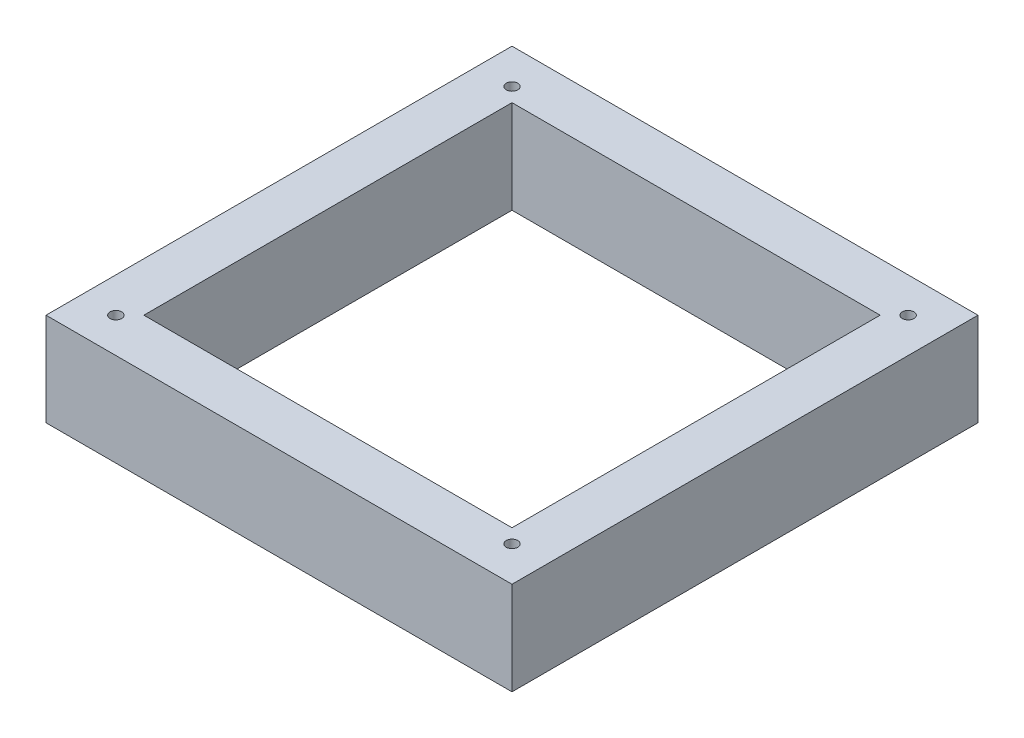
ISO-10303-21;
HEADER;
FILE_DESCRIPTION(('STEP AP214'),'2;1');
FILE_NAME('part.step','',(''),(''),'','','');
FILE_SCHEMA(('AUTOMOTIVE_DESIGN { 1 0 10303 214 1 1 1 1 }'));
ENDSEC;
DATA;
#1=APPLICATION_CONTEXT('core data for automotive mechanical design processes');
#2=APPLICATION_PROTOCOL_DEFINITION('international standard','automotive_design',2000,#1);
#3=PRODUCT_CONTEXT('',#1,'mechanical');
#4=PRODUCT('Part','Part','',(#3));
#5=PRODUCT_RELATED_PRODUCT_CATEGORY('part','',(#4));
#6=PRODUCT_DEFINITION_FORMATION('','',#4);
#7=PRODUCT_DEFINITION_CONTEXT('part definition',#1,'design');
#8=PRODUCT_DEFINITION('design','',#6,#7);
#9=PRODUCT_DEFINITION_SHAPE('','',#8);
#10=(LENGTH_UNIT() NAMED_UNIT(*) SI_UNIT(.MILLI.,.METRE.));
#11=(NAMED_UNIT(*) PLANE_ANGLE_UNIT() SI_UNIT($,.RADIAN.));
#12=(NAMED_UNIT(*) SI_UNIT($,.STERADIAN.) SOLID_ANGLE_UNIT());
#13=UNCERTAINTY_MEASURE_WITH_UNIT(LENGTH_MEASURE(1.E-05),#10,'distance_accuracy_value','');
#14=(GEOMETRIC_REPRESENTATION_CONTEXT(3) GLOBAL_UNCERTAINTY_ASSIGNED_CONTEXT((#13)) GLOBAL_UNIT_ASSIGNED_CONTEXT((#10,
#11,#12)) REPRESENTATION_CONTEXT('',''));
#15=CARTESIAN_POINT('',(0.,0.,0.));
#16=DIRECTION('',(0.,0.,1.));
#17=DIRECTION('',(1.,0.,0.));
#18=AXIS2_PLACEMENT_3D('',#15,#16,#17);
#19=CARTESIAN_POINT('',(0.,40.,0.));
#20=DIRECTION('',(0.,-1.,0.));
#21=DIRECTION('',(0.,0.,-1.));
#22=AXIS2_PLACEMENT_3D('',#19,#20,#21);
#23=PLANE('',#22);
#24=DIRECTION('',(0.,0.,1.));
#25=VECTOR('',#24,1.);
#26=CARTESIAN_POINT('',(0.,40.,0.));
#27=LINE('',#26,#25);
#28=CARTESIAN_POINT('',(0.,40.,-200.));
#29=VERTEX_POINT('',#28);
#30=CARTESIAN_POINT('',(0.,40.,0.));
#31=VERTEX_POINT('',#30);
#32=EDGE_CURVE('E137',#29,#31,#27,.T.);
#33=ORIENTED_EDGE('',*,*,#32,.T.);
#34=DIRECTION('',(1.,0.,0.));
#35=VECTOR('',#34,1.);
#36=CARTESIAN_POINT('',(0.,40.,0.));
#37=LINE('',#36,#35);
#38=CARTESIAN_POINT('',(200.,40.,0.));
#39=VERTEX_POINT('',#38);
#40=EDGE_CURVE('E140',#31,#39,#37,.T.);
#41=ORIENTED_EDGE('',*,*,#40,.T.);
#42=DIRECTION('',(0.,0.,-1.));
#43=VECTOR('',#42,1.);
#44=CARTESIAN_POINT('',(200.,40.,0.));
#45=LINE('',#44,#43);
#46=CARTESIAN_POINT('',(200.,40.,-200.));
#47=VERTEX_POINT('',#46);
#48=EDGE_CURVE('E143',#39,#47,#45,.T.);
#49=ORIENTED_EDGE('',*,*,#48,.T.);
#50=DIRECTION('',(-1.,0.,0.));
#51=VECTOR('',#50,1.);
#52=CARTESIAN_POINT('',(0.,40.,-200.));
#53=LINE('',#52,#51);
#54=EDGE_CURVE('E145',#47,#29,#53,.T.);
#55=ORIENTED_EDGE('',*,*,#54,.T.);
#56=EDGE_LOOP('',(#33,#41,#49,#55));
#57=FACE_BOUND('',#56,.T.);
#58=DIRECTION('',(0.,0.,-1.));
#59=VECTOR('',#58,1.);
#60=CARTESIAN_POINT('',(179.,40.,-20.9999999999999));
#61=LINE('',#60,#59);
#62=CARTESIAN_POINT('',(179.,40.,-20.9999999999999));
#63=VERTEX_POINT('',#62);
#64=CARTESIAN_POINT('',(179.,40.,-179.));
#65=VERTEX_POINT('',#64);
#66=EDGE_CURVE('E98',#63,#65,#61,.T.);
#67=ORIENTED_EDGE('',*,*,#66,.F.);
#68=DIRECTION('',(1.,0.,0.));
#69=VECTOR('',#68,1.);
#70=CARTESIAN_POINT('',(21.,40.,-20.9999999999999));
#71=LINE('',#70,#69);
#72=CARTESIAN_POINT('',(21.,40.,-20.9999999999999));
#73=VERTEX_POINT('',#72);
#74=EDGE_CURVE('E121',#73,#63,#71,.T.);
#75=ORIENTED_EDGE('',*,*,#74,.F.);
#76=DIRECTION('',(0.,0.,1.));
#77=VECTOR('',#76,1.);
#78=CARTESIAN_POINT('',(21.,40.,-20.9999999999999));
#79=LINE('',#78,#77);
#80=CARTESIAN_POINT('',(21.,40.,-179.));
#81=VERTEX_POINT('',#80);
#82=EDGE_CURVE('E119',#81,#73,#79,.T.);
#83=ORIENTED_EDGE('',*,*,#82,.F.);
#84=DIRECTION('',(-1.,0.,0.));
#85=VECTOR('',#84,1.);
#86=CARTESIAN_POINT('',(21.,40.,-179.));
#87=LINE('',#86,#85);
#88=EDGE_CURVE('E106',#65,#81,#87,.T.);
#89=ORIENTED_EDGE('',*,*,#88,.F.);
#90=EDGE_LOOP('',(#67,#75,#83,#89));
#91=FACE_BOUND('',#90,.T.);
#92=CARTESIAN_POINT('',(185.,40.,-185.));
#93=DIRECTION('',(0.,1.,0.));
#94=DIRECTION('',(0.,0.,1.));
#95=AXIS2_PLACEMENT_3D('',#92,#93,#94);
#96=CIRCLE('',#95,2.5);
#97=CARTESIAN_POINT('',(185.,40.,-182.5));
#98=VERTEX_POINT('',#97);
#99=EDGE_CURVE('E127',#98,#98,#96,.T.);
#100=ORIENTED_EDGE('',*,*,#99,.F.);
#101=EDGE_LOOP('',(#100));
#102=FACE_BOUND('',#101,.T.);
#103=CARTESIAN_POINT('',(185.,40.,-15.));
#104=DIRECTION('',(0.,1.,0.));
#105=DIRECTION('',(0.,0.,1.));
#106=AXIS2_PLACEMENT_3D('',#103,#104,#105);
#107=CIRCLE('',#106,2.5);
#108=CARTESIAN_POINT('',(185.,40.,-12.5));
#109=VERTEX_POINT('',#108);
#110=EDGE_CURVE('E249',#109,#109,#107,.T.);
#111=ORIENTED_EDGE('',*,*,#110,.F.);
#112=EDGE_LOOP('',(#111));
#113=FACE_BOUND('',#112,.T.);
#114=CARTESIAN_POINT('',(15.,40.,-15.));
#115=DIRECTION('',(0.,1.,0.));
#116=DIRECTION('',(0.,0.,1.));
#117=AXIS2_PLACEMENT_3D('',#114,#115,#116);
#118=CIRCLE('',#117,2.5);
#119=CARTESIAN_POINT('',(15.,40.,-12.5));
#120=VERTEX_POINT('',#119);
#121=EDGE_CURVE('E243',#120,#120,#118,.T.);
#122=ORIENTED_EDGE('',*,*,#121,.F.);
#123=EDGE_LOOP('',(#122));
#124=FACE_BOUND('',#123,.T.);
#125=CARTESIAN_POINT('',(15.,40.,-185.));
#126=DIRECTION('',(0.,1.,0.));
#127=DIRECTION('',(0.,0.,1.));
#128=AXIS2_PLACEMENT_3D('',#125,#126,#127);
#129=CIRCLE('',#128,2.5);
#130=CARTESIAN_POINT('',(15.,40.,-182.5));
#131=VERTEX_POINT('',#130);
#132=EDGE_CURVE('E234',#131,#131,#129,.T.);
#133=ORIENTED_EDGE('',*,*,#132,.F.);
#134=EDGE_LOOP('',(#133));
#135=FACE_BOUND('',#134,.T.);
#136=ADVANCED_FACE('F33',(#57,#91,#102,#113,#124,#135),#23,.F.);
#137=CARTESIAN_POINT('',(0.,0.,0.));
#138=DIRECTION('',(0.,-1.,0.));
#139=DIRECTION('',(0.,0.,-1.));
#140=AXIS2_PLACEMENT_3D('',#137,#138,#139);
#141=PLANE('',#140);
#142=CARTESIAN_POINT('',(15.,0.,-15.));
#143=DIRECTION('',(0.,1.,0.));
#144=DIRECTION('',(0.,0.,1.));
#145=AXIS2_PLACEMENT_3D('',#142,#143,#144);
#146=CIRCLE('',#145,2.5);
#147=CARTESIAN_POINT('',(15.,0.,-12.5));
#148=VERTEX_POINT('',#147);
#149=EDGE_CURVE('E240',#148,#148,#146,.T.);
#150=ORIENTED_EDGE('',*,*,#149,.T.);
#151=EDGE_LOOP('',(#150));
#152=FACE_BOUND('',#151,.T.);
#153=CARTESIAN_POINT('',(185.,0.,-185.));
#154=DIRECTION('',(0.,1.,0.));
#155=DIRECTION('',(0.,0.,1.));
#156=AXIS2_PLACEMENT_3D('',#153,#154,#155);
#157=CIRCLE('',#156,2.5);
#158=CARTESIAN_POINT('',(185.,0.,-182.5));
#159=VERTEX_POINT('',#158);
#160=EDGE_CURVE('E252',#159,#159,#157,.T.);
#161=ORIENTED_EDGE('',*,*,#160,.T.);
#162=EDGE_LOOP('',(#161));
#163=FACE_BOUND('',#162,.T.);
#164=DIRECTION('',(0.,0.,1.));
#165=VECTOR('',#164,1.);
#166=CARTESIAN_POINT('',(0.,0.,0.));
#167=LINE('',#166,#165);
#168=CARTESIAN_POINT('',(0.,0.,-200.));
#169=VERTEX_POINT('',#168);
#170=CARTESIAN_POINT('',(0.,0.,0.));
#171=VERTEX_POINT('',#170);
#172=EDGE_CURVE('E114',#169,#171,#167,.T.);
#173=ORIENTED_EDGE('',*,*,#172,.F.);
#174=DIRECTION('',(-1.,0.,0.));
#175=VECTOR('',#174,1.);
#176=CARTESIAN_POINT('',(0.,0.,-200.));
#177=LINE('',#176,#175);
#178=CARTESIAN_POINT('',(200.,0.,-200.));
#179=VERTEX_POINT('',#178);
#180=EDGE_CURVE('E141',#179,#169,#177,.T.);
#181=ORIENTED_EDGE('',*,*,#180,.F.);
#182=DIRECTION('',(0.,0.,-1.));
#183=VECTOR('',#182,1.);
#184=CARTESIAN_POINT('',(200.,0.,0.));
#185=LINE('',#184,#183);
#186=CARTESIAN_POINT('',(200.,0.,0.));
#187=VERTEX_POINT('',#186);
#188=EDGE_CURVE('E152',#187,#179,#185,.T.);
#189=ORIENTED_EDGE('',*,*,#188,.F.);
#190=DIRECTION('',(1.,0.,0.));
#191=VECTOR('',#190,1.);
#192=CARTESIAN_POINT('',(0.,0.,0.));
#193=LINE('',#192,#191);
#194=EDGE_CURVE('E150',#171,#187,#193,.T.);
#195=ORIENTED_EDGE('',*,*,#194,.F.);
#196=EDGE_LOOP('',(#173,#181,#189,#195));
#197=FACE_BOUND('',#196,.T.);
#198=DIRECTION('',(1.,0.,0.));
#199=VECTOR('',#198,1.);
#200=CARTESIAN_POINT('',(21.,0.,-20.9999999999999));
#201=LINE('',#200,#199);
#202=CARTESIAN_POINT('',(21.,0.,-20.9999999999999));
#203=VERTEX_POINT('',#202);
#204=CARTESIAN_POINT('',(179.,0.,-20.9999999999999));
#205=VERTEX_POINT('',#204);
#206=EDGE_CURVE('E107',#203,#205,#201,.T.);
#207=ORIENTED_EDGE('',*,*,#206,.T.);
#208=DIRECTION('',(0.,0.,-1.));
#209=VECTOR('',#208,1.);
#210=CARTESIAN_POINT('',(179.,0.,-20.9999999999999));
#211=LINE('',#210,#209);
#212=CARTESIAN_POINT('',(179.,0.,-179.));
#213=VERTEX_POINT('',#212);
#214=EDGE_CURVE('E56',#205,#213,#211,.T.);
#215=ORIENTED_EDGE('',*,*,#214,.T.);
#216=DIRECTION('',(-1.,0.,0.));
#217=VECTOR('',#216,1.);
#218=CARTESIAN_POINT('',(21.,0.,-179.));
#219=LINE('',#218,#217);
#220=CARTESIAN_POINT('',(21.,0.,-179.));
#221=VERTEX_POINT('',#220);
#222=EDGE_CURVE('E113',#213,#221,#219,.T.);
#223=ORIENTED_EDGE('',*,*,#222,.T.);
#224=DIRECTION('',(0.,0.,1.));
#225=VECTOR('',#224,1.);
#226=CARTESIAN_POINT('',(21.,0.,-20.9999999999999));
#227=LINE('',#226,#225);
#228=EDGE_CURVE('E129',#221,#203,#227,.T.);
#229=ORIENTED_EDGE('',*,*,#228,.T.);
#230=EDGE_LOOP('',(#207,#215,#223,#229));
#231=FACE_BOUND('',#230,.T.);
#232=CARTESIAN_POINT('',(185.,0.,-15.));
#233=DIRECTION('',(0.,1.,0.));
#234=DIRECTION('',(0.,0.,1.));
#235=AXIS2_PLACEMENT_3D('',#232,#233,#234);
#236=CIRCLE('',#235,2.5);
#237=CARTESIAN_POINT('',(185.,0.,-12.5));
#238=VERTEX_POINT('',#237);
#239=EDGE_CURVE('E246',#238,#238,#236,.T.);
#240=ORIENTED_EDGE('',*,*,#239,.T.);
#241=EDGE_LOOP('',(#240));
#242=FACE_BOUND('',#241,.T.);
#243=CARTESIAN_POINT('',(15.,0.,-185.));
#244=DIRECTION('',(0.,1.,0.));
#245=DIRECTION('',(0.,0.,1.));
#246=AXIS2_PLACEMENT_3D('',#243,#244,#245);
#247=CIRCLE('',#246,2.5);
#248=CARTESIAN_POINT('',(15.,0.,-182.5));
#249=VERTEX_POINT('',#248);
#250=EDGE_CURVE('E237',#249,#249,#247,.T.);
#251=ORIENTED_EDGE('',*,*,#250,.T.);
#252=EDGE_LOOP('',(#251));
#253=FACE_BOUND('',#252,.T.);
#254=ADVANCED_FACE('F170',(#152,#163,#197,#231,#242,#253),#141,.T.);
#255=CARTESIAN_POINT('',(0.,40.,0.));
#256=DIRECTION('',(1.,0.,0.));
#257=DIRECTION('',(0.,0.,-1.));
#258=AXIS2_PLACEMENT_3D('',#255,#256,#257);
#259=PLANE('',#258);
#260=ORIENTED_EDGE('',*,*,#172,.T.);
#261=DIRECTION('',(0.,-1.,0.));
#262=VECTOR('',#261,1.);
#263=CARTESIAN_POINT('',(0.,40.,0.));
#264=LINE('',#263,#262);
#265=EDGE_CURVE('E11',#31,#171,#264,.T.);
#266=ORIENTED_EDGE('',*,*,#265,.F.);
#267=ORIENTED_EDGE('',*,*,#32,.F.);
#268=DIRECTION('',(0.,-1.,0.));
#269=VECTOR('',#268,1.);
#270=CARTESIAN_POINT('',(0.,40.,-200.));
#271=LINE('',#270,#269);
#272=EDGE_CURVE('E147',#29,#169,#271,.T.);
#273=ORIENTED_EDGE('',*,*,#272,.T.);
#274=EDGE_LOOP('',(#260,#266,#267,#273));
#275=FACE_BOUND('',#274,.T.);
#276=ADVANCED_FACE('F35',(#275),#259,.F.);
#277=CARTESIAN_POINT('',(0.,40.,0.));
#278=DIRECTION('',(0.,0.,-1.));
#279=DIRECTION('',(-1.,0.,0.));
#280=AXIS2_PLACEMENT_3D('',#277,#278,#279);
#281=PLANE('',#280);
#282=ORIENTED_EDGE('',*,*,#194,.T.);
#283=DIRECTION('',(0.,-1.,0.));
#284=VECTOR('',#283,1.);
#285=CARTESIAN_POINT('',(200.,40.,0.));
#286=LINE('',#285,#284);
#287=EDGE_CURVE('E41',#39,#187,#286,.T.);
#288=ORIENTED_EDGE('',*,*,#287,.F.);
#289=ORIENTED_EDGE('',*,*,#40,.F.);
#290=ORIENTED_EDGE('',*,*,#265,.T.);
#291=EDGE_LOOP('',(#282,#288,#289,#290));
#292=FACE_BOUND('',#291,.T.);
#293=ADVANCED_FACE('F180',(#292),#281,.F.);
#294=CARTESIAN_POINT('',(200.,40.,0.));
#295=DIRECTION('',(-1.,0.,0.));
#296=DIRECTION('',(0.,0.,1.));
#297=AXIS2_PLACEMENT_3D('',#294,#295,#296);
#298=PLANE('',#297);
#299=ORIENTED_EDGE('',*,*,#188,.T.);
#300=DIRECTION('',(0.,-1.,0.));
#301=VECTOR('',#300,1.);
#302=CARTESIAN_POINT('',(200.,40.,-200.));
#303=LINE('',#302,#301);
#304=EDGE_CURVE('E157',#47,#179,#303,.T.);
#305=ORIENTED_EDGE('',*,*,#304,.F.);
#306=ORIENTED_EDGE('',*,*,#48,.F.);
#307=ORIENTED_EDGE('',*,*,#287,.T.);
#308=EDGE_LOOP('',(#299,#305,#306,#307));
#309=FACE_BOUND('',#308,.T.);
#310=ADVANCED_FACE('F164',(#309),#298,.F.);
#311=CARTESIAN_POINT('',(0.,40.,-200.));
#312=DIRECTION('',(0.,0.,1.));
#313=DIRECTION('',(1.,0.,0.));
#314=AXIS2_PLACEMENT_3D('',#311,#312,#313);
#315=PLANE('',#314);
#316=ORIENTED_EDGE('',*,*,#180,.T.);
#317=ORIENTED_EDGE('',*,*,#272,.F.);
#318=ORIENTED_EDGE('',*,*,#54,.F.);
#319=ORIENTED_EDGE('',*,*,#304,.T.);
#320=EDGE_LOOP('',(#316,#317,#318,#319));
#321=FACE_BOUND('',#320,.T.);
#322=ADVANCED_FACE('F174',(#321),#315,.F.);
#323=CARTESIAN_POINT('',(179.,40.,-20.9999999999999));
#324=DIRECTION('',(-1.,0.,0.));
#325=DIRECTION('',(0.,0.,1.));
#326=AXIS2_PLACEMENT_3D('',#323,#324,#325);
#327=PLANE('',#326);
#328=ORIENTED_EDGE('',*,*,#214,.F.);
#329=DIRECTION('',(0.,-1.,0.));
#330=VECTOR('',#329,1.);
#331=CARTESIAN_POINT('',(179.,40.,-20.9999999999999));
#332=LINE('',#331,#330);
#333=EDGE_CURVE('E102',#63,#205,#332,.T.);
#334=ORIENTED_EDGE('',*,*,#333,.F.);
#335=ORIENTED_EDGE('',*,*,#66,.T.);
#336=DIRECTION('',(0.,-1.,0.));
#337=VECTOR('',#336,1.);
#338=CARTESIAN_POINT('',(179.,40.,-179.));
#339=LINE('',#338,#337);
#340=EDGE_CURVE('E101',#65,#213,#339,.T.);
#341=ORIENTED_EDGE('',*,*,#340,.T.);
#342=EDGE_LOOP('',(#328,#334,#335,#341));
#343=FACE_BOUND('',#342,.T.);
#344=ADVANCED_FACE('F100',(#343),#327,.T.);
#345=CARTESIAN_POINT('',(21.,40.,-179.));
#346=DIRECTION('',(0.,0.,1.));
#347=DIRECTION('',(1.,0.,0.));
#348=AXIS2_PLACEMENT_3D('',#345,#346,#347);
#349=PLANE('',#348);
#350=ORIENTED_EDGE('',*,*,#222,.F.);
#351=ORIENTED_EDGE('',*,*,#340,.F.);
#352=ORIENTED_EDGE('',*,*,#88,.T.);
#353=DIRECTION('',(0.,-1.,0.));
#354=VECTOR('',#353,1.);
#355=CARTESIAN_POINT('',(21.,40.,-179.));
#356=LINE('',#355,#354);
#357=EDGE_CURVE('E115',#81,#221,#356,.T.);
#358=ORIENTED_EDGE('',*,*,#357,.T.);
#359=EDGE_LOOP('',(#350,#351,#352,#358));
#360=FACE_BOUND('',#359,.T.);
#361=ADVANCED_FACE('F110',(#360),#349,.T.);
#362=CARTESIAN_POINT('',(21.,40.,-20.9999999999999));
#363=DIRECTION('',(1.,0.,0.));
#364=DIRECTION('',(0.,0.,-1.));
#365=AXIS2_PLACEMENT_3D('',#362,#363,#364);
#366=PLANE('',#365);
#367=ORIENTED_EDGE('',*,*,#228,.F.);
#368=ORIENTED_EDGE('',*,*,#357,.F.);
#369=ORIENTED_EDGE('',*,*,#82,.T.);
#370=DIRECTION('',(0.,-1.,0.));
#371=VECTOR('',#370,1.);
#372=CARTESIAN_POINT('',(21.,40.,-20.9999999999999));
#373=LINE('',#372,#371);
#374=EDGE_CURVE('E48',#73,#203,#373,.T.);
#375=ORIENTED_EDGE('',*,*,#374,.T.);
#376=EDGE_LOOP('',(#367,#368,#369,#375));
#377=FACE_BOUND('',#376,.T.);
#378=ADVANCED_FACE('F204',(#377),#366,.T.);
#379=CARTESIAN_POINT('',(21.,40.,-20.9999999999999));
#380=DIRECTION('',(0.,0.,-1.));
#381=DIRECTION('',(-1.,0.,0.));
#382=AXIS2_PLACEMENT_3D('',#379,#380,#381);
#383=PLANE('',#382);
#384=ORIENTED_EDGE('',*,*,#206,.F.);
#385=ORIENTED_EDGE('',*,*,#374,.F.);
#386=ORIENTED_EDGE('',*,*,#74,.T.);
#387=ORIENTED_EDGE('',*,*,#333,.T.);
#388=EDGE_LOOP('',(#384,#385,#386,#387));
#389=FACE_BOUND('',#388,.T.);
#390=ADVANCED_FACE('F208',(#389),#383,.T.);
#391=CARTESIAN_POINT('',(185.,40.,-185.));
#392=DIRECTION('',(0.,-1.,0.));
#393=DIRECTION('',(0.,0.,-1.));
#394=AXIS2_PLACEMENT_3D('',#391,#392,#393);
#395=CYLINDRICAL_SURFACE('',#394,2.5);
#396=ORIENTED_EDGE('',*,*,#99,.T.);
#397=EDGE_LOOP('',(#396));
#398=FACE_BOUND('',#397,.T.);
#399=ORIENTED_EDGE('',*,*,#160,.F.);
#400=EDGE_LOOP('',(#399));
#401=FACE_BOUND('',#400,.T.);
#402=ADVANCED_FACE('F214',(#398,#401),#395,.F.);
#403=CARTESIAN_POINT('',(185.,40.,-15.));
#404=DIRECTION('',(0.,-1.,0.));
#405=DIRECTION('',(0.,0.,-1.));
#406=AXIS2_PLACEMENT_3D('',#403,#404,#405);
#407=CYLINDRICAL_SURFACE('',#406,2.5);
#408=ORIENTED_EDGE('',*,*,#110,.T.);
#409=EDGE_LOOP('',(#408));
#410=FACE_BOUND('',#409,.T.);
#411=ORIENTED_EDGE('',*,*,#239,.F.);
#412=EDGE_LOOP('',(#411));
#413=FACE_BOUND('',#412,.T.);
#414=ADVANCED_FACE('F217',(#410,#413),#407,.F.);
#415=CARTESIAN_POINT('',(15.,40.,-15.));
#416=DIRECTION('',(0.,-1.,0.));
#417=DIRECTION('',(0.,0.,-1.));
#418=AXIS2_PLACEMENT_3D('',#415,#416,#417);
#419=CYLINDRICAL_SURFACE('',#418,2.5);
#420=ORIENTED_EDGE('',*,*,#121,.T.);
#421=EDGE_LOOP('',(#420));
#422=FACE_BOUND('',#421,.T.);
#423=ORIENTED_EDGE('',*,*,#149,.F.);
#424=EDGE_LOOP('',(#423));
#425=FACE_BOUND('',#424,.T.);
#426=ADVANCED_FACE('F221',(#422,#425),#419,.F.);
#427=CARTESIAN_POINT('',(15.,40.,-185.));
#428=DIRECTION('',(0.,-1.,0.));
#429=DIRECTION('',(0.,0.,-1.));
#430=AXIS2_PLACEMENT_3D('',#427,#428,#429);
#431=CYLINDRICAL_SURFACE('',#430,2.5);
#432=ORIENTED_EDGE('',*,*,#132,.T.);
#433=EDGE_LOOP('',(#432));
#434=FACE_BOUND('',#433,.T.);
#435=ORIENTED_EDGE('',*,*,#250,.F.);
#436=EDGE_LOOP('',(#435));
#437=FACE_BOUND('',#436,.T.);
#438=ADVANCED_FACE('F225',(#434,#437),#431,.F.);
#439=CLOSED_SHELL('',(#136,#254,#276,#293,#310,#322,#344,#361,#378,#390,#402,#414,#426,#438));
#440=MANIFOLD_SOLID_BREP('B2',#439);
#441=ADVANCED_BREP_SHAPE_REPRESENTATION('',(#18,#440),#14);
#442=SHAPE_DEFINITION_REPRESENTATION(#9,#441);
ENDSEC;
END-ISO-10303-21;
